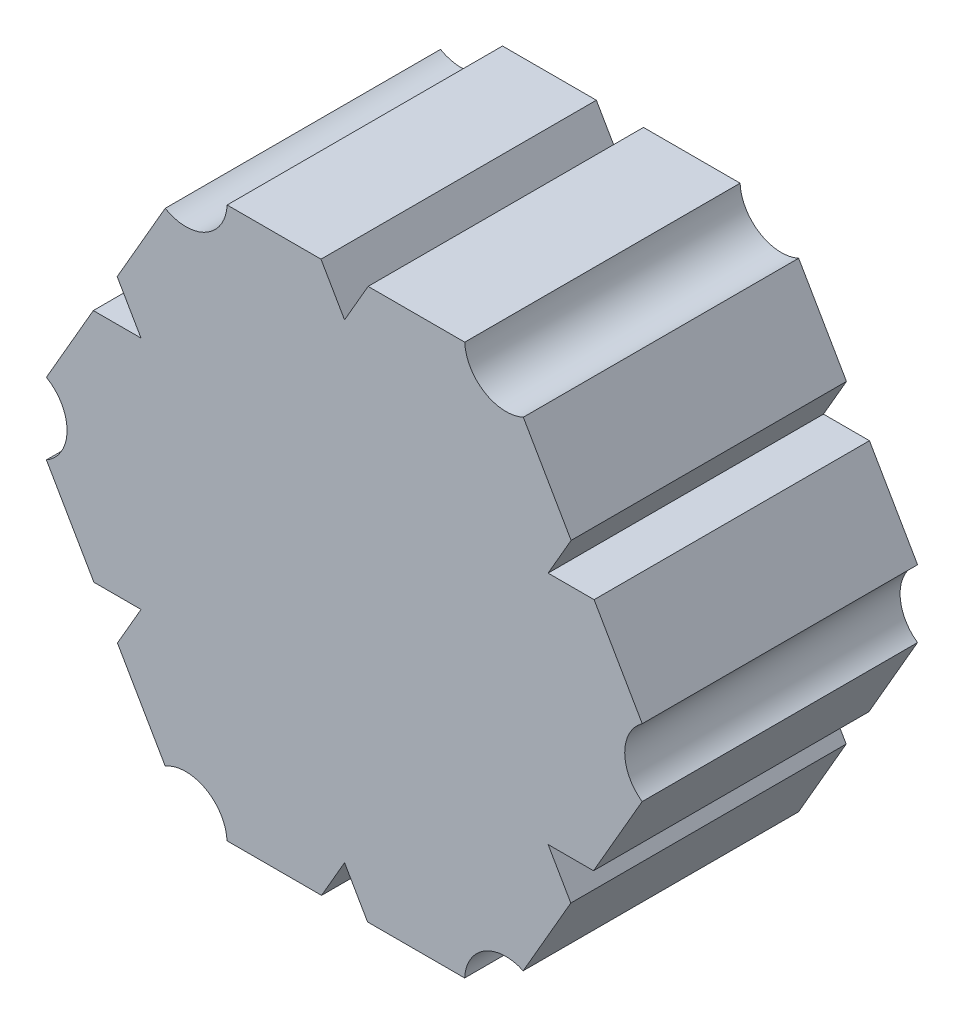
ISO-10303-21;
HEADER;
FILE_DESCRIPTION(('STEP AP214'),'2;1');
FILE_NAME('part.step','',(''),(''),'','','');
FILE_SCHEMA(('AUTOMOTIVE_DESIGN { 1 0 10303 214 1 1 1 1 }'));
ENDSEC;
DATA;
#1=APPLICATION_CONTEXT('core data for automotive mechanical design processes');
#2=APPLICATION_PROTOCOL_DEFINITION('international standard','automotive_design',2000,#1);
#3=PRODUCT_CONTEXT('',#1,'mechanical');
#4=PRODUCT('Part','Part','',(#3));
#5=PRODUCT_RELATED_PRODUCT_CATEGORY('part','',(#4));
#6=PRODUCT_DEFINITION_FORMATION('','',#4);
#7=PRODUCT_DEFINITION_CONTEXT('part definition',#1,'design');
#8=PRODUCT_DEFINITION('design','',#6,#7);
#9=PRODUCT_DEFINITION_SHAPE('','',#8);
#10=(LENGTH_UNIT() NAMED_UNIT(*) SI_UNIT(.MILLI.,.METRE.));
#11=(NAMED_UNIT(*) PLANE_ANGLE_UNIT() SI_UNIT($,.RADIAN.));
#12=(NAMED_UNIT(*) SI_UNIT($,.STERADIAN.) SOLID_ANGLE_UNIT());
#13=UNCERTAINTY_MEASURE_WITH_UNIT(LENGTH_MEASURE(1.E-05),#10,'distance_accuracy_value','');
#14=(GEOMETRIC_REPRESENTATION_CONTEXT(3) GLOBAL_UNCERTAINTY_ASSIGNED_CONTEXT((#13)) GLOBAL_UNIT_ASSIGNED_CONTEXT((#10,
#11,#12)) REPRESENTATION_CONTEXT('',''));
#15=CARTESIAN_POINT('',(0.,0.,0.));
#16=DIRECTION('',(0.,0.,1.));
#17=DIRECTION('',(1.,0.,0.));
#18=AXIS2_PLACEMENT_3D('',#15,#16,#17);
#19=CARTESIAN_POINT('',(11.5470053837925,-20.,10.));
#20=DIRECTION('',(-0.866025403784439,0.5,0.));
#21=DIRECTION('',(-0.5,-0.866025403784439,0.));
#22=AXIS2_PLACEMENT_3D('',#19,#20,#21);
#23=PLANE('',#22);
#24=DIRECTION('',(0.5,0.866025403784439,0.));
#25=VECTOR('',#24,1.);
#26=CARTESIAN_POINT('',(11.5470053837925,-20.,-10.));
#27=LINE('',#26,#25);
#28=CARTESIAN_POINT('',(18.145242431363,-8.5715181932246,-10.));
#29=VERTEX_POINT('',#28);
#30=CARTESIAN_POINT('',(21.6755144377949,-2.45690771354651,-10.));
#31=VERTEX_POINT('',#30);
#32=EDGE_CURVE('E314',#29,#31,#27,.T.);
#33=ORIENTED_EDGE('',*,*,#32,.T.);
#34=DIRECTION('',(0.,0.,1.));
#35=VECTOR('',#34,1.);
#36=CARTESIAN_POINT('',(21.6755144377949,-2.45690771354651,-10.));
#37=LINE('',#36,#35);
#38=CARTESIAN_POINT('',(21.6755144377949,-2.45690771354651,10.));
#39=VERTEX_POINT('',#38);
#40=EDGE_CURVE('E474',#31,#39,#37,.T.);
#41=ORIENTED_EDGE('',*,*,#40,.T.);
#42=DIRECTION('',(0.5,0.866025403784439,0.));
#43=VECTOR('',#42,1.);
#44=CARTESIAN_POINT('',(11.5470053837925,-20.,10.));
#45=LINE('',#44,#43);
#46=CARTESIAN_POINT('',(18.145242431363,-8.5715181932246,10.));
#47=VERTEX_POINT('',#46);
#48=EDGE_CURVE('E260',#47,#39,#45,.T.);
#49=ORIENTED_EDGE('',*,*,#48,.F.);
#50=DIRECTION('',(0.,0.,-1.));
#51=VECTOR('',#50,1.);
#52=CARTESIAN_POINT('',(18.145242431363,-8.5715181932246,10.));
#53=LINE('',#52,#51);
#54=EDGE_CURVE('E420',#47,#29,#53,.T.);
#55=ORIENTED_EDGE('',*,*,#54,.T.);
#56=EDGE_LOOP('',(#33,#41,#49,#55));
#57=FACE_BOUND('',#56,.T.);
#58=ADVANCED_FACE('F39',(#57),#23,.F.);
#59=CARTESIAN_POINT('',(23.094010767585,0.,10.));
#60=DIRECTION('',(-0.866025403784439,-0.5,0.));
#61=DIRECTION('',(0.5,-0.866025403784439,0.));
#62=AXIS2_PLACEMENT_3D('',#59,#60,#61);
#63=PLANE('',#62);
#64=DIRECTION('',(-0.5,0.866025403784438,0.));
#65=VECTOR('',#64,1.);
#66=CARTESIAN_POINT('',(23.094010767585,0.,-10.));
#67=LINE('',#66,#65);
#68=CARTESIAN_POINT('',(16.5164192440695,11.3927227101633,-10.));
#69=VERTEX_POINT('',#68);
#70=CARTESIAN_POINT('',(13.0447315470883,17.4058621893464,-10.));
#71=VERTEX_POINT('',#70);
#72=EDGE_CURVE('E297',#69,#71,#67,.T.);
#73=ORIENTED_EDGE('',*,*,#72,.T.);
#74=DIRECTION('',(0.,0.,1.));
#75=VECTOR('',#74,1.);
#76=CARTESIAN_POINT('',(13.0447315470883,17.4058621893464,-10.));
#77=LINE('',#76,#75);
#78=CARTESIAN_POINT('',(13.0447315470883,17.4058621893464,10.));
#79=VERTEX_POINT('',#78);
#80=EDGE_CURVE('E307',#71,#79,#77,.T.);
#81=ORIENTED_EDGE('',*,*,#80,.T.);
#82=DIRECTION('',(-0.5,0.866025403784438,0.));
#83=VECTOR('',#82,1.);
#84=CARTESIAN_POINT('',(23.094010767585,0.,10.));
#85=LINE('',#84,#83);
#86=CARTESIAN_POINT('',(16.5164192440695,11.3927227101633,10.));
#87=VERTEX_POINT('',#86);
#88=EDGE_CURVE('E446',#87,#79,#85,.T.);
#89=ORIENTED_EDGE('',*,*,#88,.F.);
#90=DIRECTION('',(0.,0.,-1.));
#91=VECTOR('',#90,1.);
#92=CARTESIAN_POINT('',(16.5164192440695,11.3927227101633,10.));
#93=LINE('',#92,#91);
#94=EDGE_CURVE('E309',#87,#69,#93,.T.);
#95=ORIENTED_EDGE('',*,*,#94,.T.);
#96=EDGE_LOOP('',(#73,#81,#89,#95));
#97=FACE_BOUND('',#96,.T.);
#98=ADVANCED_FACE('F305',(#97),#63,.F.);
#99=CARTESIAN_POINT('',(11.5470053837925,20.,10.));
#100=DIRECTION('',(0.,-1.,0.));
#101=DIRECTION('',(0.,0.,-1.));
#102=AXIS2_PLACEMENT_3D('',#99,#100,#101);
#103=PLANE('',#102);
#104=DIRECTION('',(-1.,0.,0.));
#105=VECTOR('',#104,1.);
#106=CARTESIAN_POINT('',(11.5470053837925,20.,-10.));
#107=LINE('',#106,#105);
#108=CARTESIAN_POINT('',(-1.64946871134878,20.,-10.));
#109=VERTEX_POINT('',#108);
#110=CARTESIAN_POINT('',(-8.46702443896172,20.,-10.));
#111=VERTEX_POINT('',#110);
#112=EDGE_CURVE('E313',#109,#111,#107,.T.);
#113=ORIENTED_EDGE('',*,*,#112,.T.);
#114=DIRECTION('',(0.,0.,1.));
#115=VECTOR('',#114,1.);
#116=CARTESIAN_POINT('',(-8.46702443896172,20.,-10.));
#117=LINE('',#116,#115);
#118=CARTESIAN_POINT('',(-8.46702443896172,20.,10.));
#119=VERTEX_POINT('',#118);
#120=EDGE_CURVE('E353',#111,#119,#117,.T.);
#121=ORIENTED_EDGE('',*,*,#120,.T.);
#122=DIRECTION('',(-1.,0.,0.));
#123=VECTOR('',#122,1.);
#124=CARTESIAN_POINT('',(11.5470053837925,20.,10.));
#125=LINE('',#124,#123);
#126=CARTESIAN_POINT('',(-1.64946871134878,20.,10.));
#127=VERTEX_POINT('',#126);
#128=EDGE_CURVE('E449',#127,#119,#125,.T.);
#129=ORIENTED_EDGE('',*,*,#128,.F.);
#130=DIRECTION('',(0.,0.,-1.));
#131=VECTOR('',#130,1.);
#132=CARTESIAN_POINT('',(-1.64946871134878,20.,10.));
#133=LINE('',#132,#131);
#134=EDGE_CURVE('E410',#127,#109,#133,.T.);
#135=ORIENTED_EDGE('',*,*,#134,.T.);
#136=EDGE_LOOP('',(#113,#121,#129,#135));
#137=FACE_BOUND('',#136,.T.);
#138=ADVANCED_FACE('F491',(#137),#103,.F.);
#139=CARTESIAN_POINT('',(-23.094010767585,0.,10.));
#140=DIRECTION('',(0.866025403784439,0.5,0.));
#141=DIRECTION('',(-0.5,0.866025403784439,0.));
#142=AXIS2_PLACEMENT_3D('',#139,#140,#141);
#143=PLANE('',#142);
#144=DIRECTION('',(0.5,-0.866025403784438,0.));
#145=VECTOR('',#144,1.);
#146=CARTESIAN_POINT('',(-23.094010767585,0.,-10.));
#147=LINE('',#146,#145);
#148=CARTESIAN_POINT('',(-16.4338371478492,-11.5357590966123,-10.));
#149=VERTEX_POINT('',#148);
#150=CARTESIAN_POINT('',(-12.9679862666577,-17.5387889142934,-10.));
#151=VERTEX_POINT('',#150);
#152=EDGE_CURVE('E320',#149,#151,#147,.T.);
#153=ORIENTED_EDGE('',*,*,#152,.T.);
#154=DIRECTION('',(0.,0.,1.));
#155=VECTOR('',#154,1.);
#156=CARTESIAN_POINT('',(-12.9679862666577,-17.5387889142934,-10.));
#157=LINE('',#156,#155);
#158=CARTESIAN_POINT('',(-12.9679862666577,-17.5387889142934,10.));
#159=VERTEX_POINT('',#158);
#160=EDGE_CURVE('E54',#151,#159,#157,.T.);
#161=ORIENTED_EDGE('',*,*,#160,.T.);
#162=DIRECTION('',(0.5,-0.866025403784438,0.));
#163=VECTOR('',#162,1.);
#164=CARTESIAN_POINT('',(-23.094010767585,0.,10.));
#165=LINE('',#164,#163);
#166=CARTESIAN_POINT('',(-16.4338371478492,-11.5357590966123,10.));
#167=VERTEX_POINT('',#166);
#168=EDGE_CURVE('E455',#167,#159,#165,.T.);
#169=ORIENTED_EDGE('',*,*,#168,.F.);
#170=DIRECTION('',(0.,0.,-1.));
#171=VECTOR('',#170,1.);
#172=CARTESIAN_POINT('',(-16.4338371478492,-11.5357590966123,10.));
#173=LINE('',#172,#171);
#174=EDGE_CURVE('E430',#167,#149,#173,.T.);
#175=ORIENTED_EDGE('',*,*,#174,.T.);
#176=EDGE_LOOP('',(#153,#161,#169,#175));
#177=FACE_BOUND('',#176,.T.);
#178=ADVANCED_FACE('F523',(#177),#143,.F.);
#179=CARTESIAN_POINT('',(-11.5470053837925,-20.,10.));
#180=DIRECTION('',(0.,1.,0.));
#181=DIRECTION('',(0.,0.,1.));
#182=AXIS2_PLACEMENT_3D('',#179,#180,#181);
#183=PLANE('',#182);
#184=DIRECTION('',(1.,0.,0.));
#185=VECTOR('',#184,1.);
#186=CARTESIAN_POINT('',(-11.5470053837925,-20.,-10.));
#187=LINE('',#186,#185);
#188=CARTESIAN_POINT('',(1.73205080756897,-20.,-10.));
#189=VERTEX_POINT('',#188);
#190=CARTESIAN_POINT('',(8.78352099786609,-20.,-10.));
#191=VERTEX_POINT('',#190);
#192=EDGE_CURVE('E261',#189,#191,#187,.T.);
#193=ORIENTED_EDGE('',*,*,#192,.T.);
#194=DIRECTION('',(0.,0.,1.));
#195=VECTOR('',#194,1.);
#196=CARTESIAN_POINT('',(8.78352099786609,-20.,-10.));
#197=LINE('',#196,#195);
#198=CARTESIAN_POINT('',(8.78352099786609,-20.,10.));
#199=VERTEX_POINT('',#198);
#200=EDGE_CURVE('E62',#191,#199,#197,.T.);
#201=ORIENTED_EDGE('',*,*,#200,.T.);
#202=DIRECTION('',(1.,0.,0.));
#203=VECTOR('',#202,1.);
#204=CARTESIAN_POINT('',(-11.5470053837925,-20.,10.));
#205=LINE('',#204,#203);
#206=CARTESIAN_POINT('',(1.73205080756897,-20.,10.));
#207=VERTEX_POINT('',#206);
#208=EDGE_CURVE('E456',#207,#199,#205,.T.);
#209=ORIENTED_EDGE('',*,*,#208,.F.);
#210=DIRECTION('',(0.,0.,-1.));
#211=VECTOR('',#210,1.);
#212=CARTESIAN_POINT('',(1.73205080756897,-20.,10.));
#213=LINE('',#212,#211);
#214=EDGE_CURVE('E425',#207,#189,#213,.T.);
#215=ORIENTED_EDGE('',*,*,#214,.T.);
#216=EDGE_LOOP('',(#193,#201,#209,#215));
#217=FACE_BOUND('',#216,.T.);
#218=ADVANCED_FACE('F468',(#217),#183,.F.);
#219=CARTESIAN_POINT('',(-11.5470053837925,20.,10.));
#220=DIRECTION('',(0.866025403784439,-0.5,0.));
#221=DIRECTION('',(0.5,0.866025403784439,0.));
#222=AXIS2_PLACEMENT_3D('',#219,#220,#221);
#223=PLANE('',#222);
#224=DIRECTION('',(-0.5,-0.866025403784439,0.));
#225=VECTOR('',#224,1.);
#226=CARTESIAN_POINT('',(-11.5470053837925,20.,-10.));
#227=LINE('',#226,#225);
#228=CARTESIAN_POINT('',(-18.1865334794732,8.5,-10.));
#229=VERTEX_POINT('',#228);
#230=CARTESIAN_POINT('',(-21.594010767585,2.59807621135331,-10.));
#231=VERTEX_POINT('',#230);
#232=EDGE_CURVE('E318',#229,#231,#227,.T.);
#233=ORIENTED_EDGE('',*,*,#232,.T.);
#234=DIRECTION('',(0.,0.,1.));
#235=VECTOR('',#234,1.);
#236=CARTESIAN_POINT('',(-21.594010767585,2.59807621135331,-10.));
#237=LINE('',#236,#235);
#238=CARTESIAN_POINT('',(-21.594010767585,2.59807621135331,10.));
#239=VERTEX_POINT('',#238);
#240=EDGE_CURVE('E332',#231,#239,#237,.T.);
#241=ORIENTED_EDGE('',*,*,#240,.T.);
#242=DIRECTION('',(-0.5,-0.866025403784439,0.));
#243=VECTOR('',#242,1.);
#244=CARTESIAN_POINT('',(-11.5470053837925,20.,10.));
#245=LINE('',#244,#243);
#246=CARTESIAN_POINT('',(-18.1865334794732,8.5,10.));
#247=VERTEX_POINT('',#246);
#248=EDGE_CURVE('E452',#247,#239,#245,.T.);
#249=ORIENTED_EDGE('',*,*,#248,.F.);
#250=DIRECTION('',(0.,0.,-1.));
#251=VECTOR('',#250,1.);
#252=CARTESIAN_POINT('',(-18.1865334794732,8.5,10.));
#253=LINE('',#252,#251);
#254=EDGE_CURVE('E334',#247,#229,#253,.T.);
#255=ORIENTED_EDGE('',*,*,#254,.T.);
#256=EDGE_LOOP('',(#233,#241,#249,#255));
#257=FACE_BOUND('',#256,.T.);
#258=ADVANCED_FACE('F330',(#257),#223,.F.);
#259=CARTESIAN_POINT('',(13.0367656375873,-17.4196595493307,10.));
#260=VERTEX_POINT('',#259);
#261=CARTESIAN_POINT('',(16.4957737200145,-11.4284818067754,10.));
#262=VERTEX_POINT('',#261);
#263=EDGE_CURVE('E264',#260,#262,#45,.T.);
#264=ORIENTED_EDGE('',*,*,#263,.F.);
#265=DIRECTION('',(0.,0.,1.));
#266=VECTOR('',#265,1.);
#267=CARTESIAN_POINT('',(13.0367656375873,-17.4196595493307,-10.));
#268=LINE('',#267,#266);
#269=CARTESIAN_POINT('',(13.0367656375873,-17.4196595493307,-10.));
#270=VERTEX_POINT('',#269);
#271=EDGE_CURVE('E471',#260,#270,#268,.F.);
#272=ORIENTED_EDGE('',*,*,#271,.T.);
#273=CARTESIAN_POINT('',(16.4957737200145,-11.4284818067754,-10.));
#274=VERTEX_POINT('',#273);
#275=EDGE_CURVE('E311',#270,#274,#27,.T.);
#276=ORIENTED_EDGE('',*,*,#275,.T.);
#277=DIRECTION('',(0.,0.,1.));
#278=VECTOR('',#277,1.);
#279=CARTESIAN_POINT('',(16.4957737200145,-11.4284818067754,10.));
#280=LINE('',#279,#278);
#281=EDGE_CURVE('E417',#274,#262,#280,.T.);
#282=ORIENTED_EDGE('',*,*,#281,.T.);
#283=EDGE_LOOP('',(#264,#272,#276,#282));
#284=FACE_BOUND('',#283,.T.);
#285=ADVANCED_FACE('F41',(#284),#23,.F.);
#286=CARTESIAN_POINT('',(21.6830589590391,2.44384021943267,10.));
#287=VERTEX_POINT('',#286);
#288=CARTESIAN_POINT('',(18.1865334794731,8.50000000000017,10.));
#289=VERTEX_POINT('',#288);
#290=EDGE_CURVE('E447',#287,#289,#85,.T.);
#291=ORIENTED_EDGE('',*,*,#290,.F.);
#292=DIRECTION('',(0.,0.,1.));
#293=VECTOR('',#292,1.);
#294=CARTESIAN_POINT('',(21.6830589590391,2.44384021943267,-10.));
#295=LINE('',#294,#293);
#296=CARTESIAN_POINT('',(21.6830589590391,2.44384021943267,-10.));
#297=VERTEX_POINT('',#296);
#298=EDGE_CURVE('E470',#287,#297,#295,.F.);
#299=ORIENTED_EDGE('',*,*,#298,.T.);
#300=CARTESIAN_POINT('',(18.1865334794731,8.50000000000016,-10.));
#301=VERTEX_POINT('',#300);
#302=EDGE_CURVE('E310',#297,#301,#67,.T.);
#303=ORIENTED_EDGE('',*,*,#302,.T.);
#304=DIRECTION('',(0.,0.,1.));
#305=VECTOR('',#304,1.);
#306=CARTESIAN_POINT('',(18.1865334794731,8.50000000000017,10.));
#307=LINE('',#306,#305);
#308=EDGE_CURVE('E413',#301,#289,#307,.T.);
#309=ORIENTED_EDGE('',*,*,#308,.T.);
#310=EDGE_LOOP('',(#291,#299,#303,#309));
#311=FACE_BOUND('',#310,.T.);
#312=ADVANCED_FACE('F553',(#311),#63,.F.);
#313=CARTESIAN_POINT('',(8.79085680455955,20.,10.));
#314=VERTEX_POINT('',#313);
#315=CARTESIAN_POINT('',(1.77334185567881,20.,10.));
#316=VERTEX_POINT('',#315);
#317=EDGE_CURVE('E450',#314,#316,#125,.T.);
#318=ORIENTED_EDGE('',*,*,#317,.F.);
#319=DIRECTION('',(0.,0.,1.));
#320=VECTOR('',#319,1.);
#321=CARTESIAN_POINT('',(8.79085680455955,20.,-10.));
#322=LINE('',#321,#320);
#323=CARTESIAN_POINT('',(8.79085680455955,20.,-10.));
#324=VERTEX_POINT('',#323);
#325=EDGE_CURVE('E482',#314,#324,#322,.F.);
#326=ORIENTED_EDGE('',*,*,#325,.T.);
#327=CARTESIAN_POINT('',(1.77334185567882,20.,-10.));
#328=VERTEX_POINT('',#327);
#329=EDGE_CURVE('E299',#324,#328,#107,.T.);
#330=ORIENTED_EDGE('',*,*,#329,.T.);
#331=DIRECTION('',(0.,0.,1.));
#332=VECTOR('',#331,1.);
#333=CARTESIAN_POINT('',(1.77334185567881,20.,10.));
#334=LINE('',#333,#332);
#335=EDGE_CURVE('E368',#328,#316,#334,.T.);
#336=ORIENTED_EDGE('',*,*,#335,.T.);
#337=EDGE_LOOP('',(#318,#326,#330,#336));
#338=FACE_BOUND('',#337,.T.);
#339=ADVANCED_FACE('F579',(#338),#103,.F.);
#340=CARTESIAN_POINT('',(-12.9679862666579,17.5387889142932,10.));
#341=VERTEX_POINT('',#340);
#342=CARTESIAN_POINT('',(-16.4544826719043,11.5,10.));
#343=VERTEX_POINT('',#342);
#344=EDGE_CURVE('E453',#341,#343,#245,.T.);
#345=ORIENTED_EDGE('',*,*,#344,.F.);
#346=DIRECTION('',(0.,0.,1.));
#347=VECTOR('',#346,1.);
#348=CARTESIAN_POINT('',(-12.9679862666579,17.5387889142932,-10.));
#349=LINE('',#348,#347);
#350=CARTESIAN_POINT('',(-12.9679862666579,17.5387889142932,-10.));
#351=VERTEX_POINT('',#350);
#352=EDGE_CURVE('E485',#341,#351,#349,.F.);
#353=ORIENTED_EDGE('',*,*,#352,.T.);
#354=CARTESIAN_POINT('',(-16.4544826719043,11.5,-10.));
#355=VERTEX_POINT('',#354);
#356=EDGE_CURVE('E319',#351,#355,#227,.T.);
#357=ORIENTED_EDGE('',*,*,#356,.T.);
#358=DIRECTION('',(0.,0.,1.));
#359=VECTOR('',#358,1.);
#360=CARTESIAN_POINT('',(-16.4544826719043,11.5,10.));
#361=LINE('',#360,#359);
#362=EDGE_CURVE('E443',#355,#343,#361,.T.);
#363=ORIENTED_EDGE('',*,*,#362,.T.);
#364=EDGE_LOOP('',(#345,#353,#357,#363));
#365=FACE_BOUND('',#364,.T.);
#366=ADVANCED_FACE('F505',(#365),#223,.F.);
#367=CARTESIAN_POINT('',(-21.594010767585,-2.59807621135332,10.));
#368=VERTEX_POINT('',#367);
#369=CARTESIAN_POINT('',(-18.145242431363,-8.57151819322463,10.));
#370=VERTEX_POINT('',#369);
#371=EDGE_CURVE('E348',#368,#370,#165,.T.);
#372=ORIENTED_EDGE('',*,*,#371,.F.);
#373=DIRECTION('',(0.,0.,1.));
#374=VECTOR('',#373,1.);
#375=CARTESIAN_POINT('',(-21.594010767585,-2.59807621135332,-10.));
#376=LINE('',#375,#374);
#377=CARTESIAN_POINT('',(-21.594010767585,-2.59807621135332,-10.));
#378=VERTEX_POINT('',#377);
#379=EDGE_CURVE('E341',#368,#378,#376,.F.);
#380=ORIENTED_EDGE('',*,*,#379,.T.);
#381=CARTESIAN_POINT('',(-18.145242431363,-8.57151819322463,-10.));
#382=VERTEX_POINT('',#381);
#383=EDGE_CURVE('E267',#378,#382,#147,.T.);
#384=ORIENTED_EDGE('',*,*,#383,.T.);
#385=DIRECTION('',(0.,0.,1.));
#386=VECTOR('',#385,1.);
#387=CARTESIAN_POINT('',(-18.145242431363,-8.57151819322463,10.));
#388=LINE('',#387,#386);
#389=EDGE_CURVE('E428',#382,#370,#388,.T.);
#390=ORIENTED_EDGE('',*,*,#389,.T.);
#391=EDGE_LOOP('',(#372,#380,#384,#390));
#392=FACE_BOUND('',#391,.T.);
#393=ADVANCED_FACE('F345',(#392),#143,.F.);
#394=CARTESIAN_POINT('',(-8.47520038223606,-20.,10.));
#395=VERTEX_POINT('',#394);
#396=CARTESIAN_POINT('',(-1.60817766323827,-20.,10.));
#397=VERTEX_POINT('',#396);
#398=EDGE_CURVE('E251',#395,#397,#205,.T.);
#399=ORIENTED_EDGE('',*,*,#398,.F.);
#400=DIRECTION('',(0.,0.,1.));
#401=VECTOR('',#400,1.);
#402=CARTESIAN_POINT('',(-8.47520038223606,-20.,-10.));
#403=LINE('',#402,#401);
#404=CARTESIAN_POINT('',(-8.47520038223606,-20.,-10.));
#405=VERTEX_POINT('',#404);
#406=EDGE_CURVE('E236',#395,#405,#403,.F.);
#407=ORIENTED_EDGE('',*,*,#406,.T.);
#408=CARTESIAN_POINT('',(-1.60817766323827,-20.,-10.));
#409=VERTEX_POINT('',#408);
#410=EDGE_CURVE('E249',#405,#409,#187,.T.);
#411=ORIENTED_EDGE('',*,*,#410,.T.);
#412=DIRECTION('',(0.,0.,1.));
#413=VECTOR('',#412,1.);
#414=CARTESIAN_POINT('',(-1.60817766323827,-20.,10.));
#415=LINE('',#414,#413);
#416=EDGE_CURVE('E423',#409,#397,#415,.T.);
#417=ORIENTED_EDGE('',*,*,#416,.T.);
#418=EDGE_LOOP('',(#399,#407,#411,#417));
#419=FACE_BOUND('',#418,.T.);
#420=ADVANCED_FACE('F247',(#419),#183,.F.);
#421=CARTESIAN_POINT('',(0.,0.,10.));
#422=DIRECTION('',(0.,0.,1.));
#423=DIRECTION('',(1.,0.,0.));
#424=AXIS2_PLACEMENT_3D('',#421,#422,#423);
#425=PLANE('',#424);
#426=CARTESIAN_POINT('',(-11.4640050745672,20.1345625126329,10.));
#427=DIRECTION('',(0.,0.,1.));
#428=DIRECTION('',(0.50000000000001,-0.866025403784433,0.));
#429=AXIS2_PLACEMENT_3D('',#426,#427,#428);
#430=CIRCLE('',#429,3.);
#431=EDGE_CURVE('E495',#341,#119,#430,.T.);
#432=ORIENTED_EDGE('',*,*,#431,.F.);
#433=ORIENTED_EDGE('',*,*,#344,.T.);
#434=DIRECTION('',(-0.5,0.866025403784439,0.));
#435=VECTOR('',#434,1.);
#436=CARTESIAN_POINT('',(-14.7224318643355,8.5,10.));
#437=LINE('',#436,#435);
#438=CARTESIAN_POINT('',(-14.7224318643355,8.5,10.));
#439=VERTEX_POINT('',#438);
#440=EDGE_CURVE('E437',#439,#343,#437,.T.);
#441=ORIENTED_EDGE('',*,*,#440,.F.);
#442=DIRECTION('',(1.,0.,0.));
#443=VECTOR('',#442,1.);
#444=CARTESIAN_POINT('',(-19.9185842870421,8.5,10.));
#445=LINE('',#444,#443);
#446=EDGE_CURVE('E433',#247,#439,#445,.T.);
#447=ORIENTED_EDGE('',*,*,#446,.F.);
#448=ORIENTED_EDGE('',*,*,#248,.T.);
#449=CARTESIAN_POINT('',(-23.094010767585,0.,10.));
#450=DIRECTION('',(0.,0.,1.));
#451=DIRECTION('',(1.,0.,0.));
#452=AXIS2_PLACEMENT_3D('',#449,#450,#451);
#453=CIRCLE('',#452,3.);
#454=EDGE_CURVE('E349',#368,#239,#453,.T.);
#455=ORIENTED_EDGE('',*,*,#454,.F.);
#456=ORIENTED_EDGE('',*,*,#371,.T.);
#457=DIRECTION('',(-1.,0.,0.));
#458=VECTOR('',#457,1.);
#459=CARTESIAN_POINT('',(-14.7224318643354,-8.57151819322462,10.));
#460=LINE('',#459,#458);
#461=CARTESIAN_POINT('',(-14.7224318643354,-8.57151819322462,10.));
#462=VERTEX_POINT('',#461);
#463=EDGE_CURVE('E360',#462,#370,#460,.T.);
#464=ORIENTED_EDGE('',*,*,#463,.F.);
#465=DIRECTION('',(0.499999999999998,0.86602540378444,0.));
#466=VECTOR('',#465,1.);
#467=CARTESIAN_POINT('',(-17.3205080756887,-13.0715181932246,10.));
#468=LINE('',#467,#466);
#469=EDGE_CURVE('E361',#167,#462,#468,.T.);
#470=ORIENTED_EDGE('',*,*,#469,.F.);
#471=ORIENTED_EDGE('',*,*,#168,.T.);
#472=CARTESIAN_POINT('',(-11.471970984068,-20.1391616326279,10.));
#473=DIRECTION('',(0.,0.,1.));
#474=DIRECTION('',(0.499999999999998,0.86602540378444,0.));
#475=AXIS2_PLACEMENT_3D('',#472,#473,#474);
#476=CIRCLE('',#475,3.);
#477=EDGE_CURVE('E252',#395,#159,#476,.T.);
#478=ORIENTED_EDGE('',*,*,#477,.F.);
#479=ORIENTED_EDGE('',*,*,#398,.T.);
#480=DIRECTION('',(-0.499999999999996,-0.866025403784441,0.));
#481=VECTOR('',#480,1.);
#482=CARTESIAN_POINT('',(0.0619365721653325,-17.1072772898369,10.));
#483=LINE('',#482,#481);
#484=CARTESIAN_POINT('',(0.0619365721653325,-17.1072772898369,10.));
#485=VERTEX_POINT('',#484);
#486=EDGE_CURVE('E370',#485,#397,#483,.T.);
#487=ORIENTED_EDGE('',*,*,#486,.F.);
#488=DIRECTION('',(-0.500000000000004,0.866025403784436,0.));
#489=VECTOR('',#488,1.);
#490=CARTESIAN_POINT('',(2.66001278351867,-21.6072772898369,10.));
#491=LINE('',#490,#489);
#492=EDGE_CURVE('E371',#207,#485,#491,.T.);
#493=ORIENTED_EDGE('',*,*,#492,.F.);
#494=ORIENTED_EDGE('',*,*,#208,.T.);
#495=CARTESIAN_POINT('',(11.7800744924671,-20.1437607526226,10.));
#496=DIRECTION('',(0.,0.,1.));
#497=DIRECTION('',(-0.500000000000004,0.866025403784436,0.));
#498=AXIS2_PLACEMENT_3D('',#495,#496,#497);
#499=CIRCLE('',#498,3.);
#500=EDGE_CURVE('E465',#260,#199,#499,.T.);
#501=ORIENTED_EDGE('',*,*,#500,.F.);
#502=ORIENTED_EDGE('',*,*,#263,.T.);
#503=DIRECTION('',(0.5,-0.866025403784439,0.));
#504=VECTOR('',#503,1.);
#505=CARTESIAN_POINT('',(14.846305008666,-8.5715181932246,10.));
#506=LINE('',#505,#504);
#507=CARTESIAN_POINT('',(14.846305008666,-8.5715181932246,10.));
#508=VERTEX_POINT('',#507);
#509=EDGE_CURVE('E381',#508,#262,#506,.T.);
#510=ORIENTED_EDGE('',*,*,#509,.F.);
#511=DIRECTION('',(-1.,0.,0.));
#512=VECTOR('',#511,1.);
#513=CARTESIAN_POINT('',(20.0424574313726,-8.5715181932246,10.));
#514=LINE('',#513,#512);
#515=EDGE_CURVE('E382',#47,#508,#514,.T.);
#516=ORIENTED_EDGE('',*,*,#515,.F.);
#517=ORIENTED_EDGE('',*,*,#48,.T.);
#518=CARTESIAN_POINT('',(23.4100801854851,-0.00919823998967443,10.));
#519=DIRECTION('',(0.,0.,1.));
#520=DIRECTION('',(-1.,0.,0.));
#521=AXIS2_PLACEMENT_3D('',#518,#519,#520);
#522=CIRCLE('',#521,3.);
#523=EDGE_CURVE('E529',#287,#39,#522,.T.);
#524=ORIENTED_EDGE('',*,*,#523,.F.);
#525=ORIENTED_EDGE('',*,*,#290,.T.);
#526=DIRECTION('',(1.,0.,0.));
#527=VECTOR('',#526,1.);
#528=CARTESIAN_POINT('',(14.8463050086659,8.50000000000014,10.));
#529=LINE('',#528,#527);
#530=CARTESIAN_POINT('',(14.8463050086659,8.50000000000014,10.));
#531=VERTEX_POINT('',#530);
#532=EDGE_CURVE('E392',#531,#289,#529,.T.);
#533=ORIENTED_EDGE('',*,*,#532,.F.);
#534=DIRECTION('',(-0.499999999999992,-0.866025403784443,0.));
#535=VECTOR('',#534,1.);
#536=CARTESIAN_POINT('',(17.4443812200192,13.0000000000002,10.));
#537=LINE('',#536,#535);
#538=EDGE_CURVE('E393',#87,#531,#537,.T.);
#539=ORIENTED_EDGE('',*,*,#538,.F.);
#540=ORIENTED_EDGE('',*,*,#88,.T.);
#541=CARTESIAN_POINT('',(11.788040401968,20.1299633926383,10.));
#542=DIRECTION('',(0.,0.,1.));
#543=DIRECTION('',(-0.499999999999992,-0.866025403784443,0.));
#544=AXIS2_PLACEMENT_3D('',#541,#542,#543);
#545=CIRCLE('',#544,3.);
#546=EDGE_CURVE('E527',#314,#79,#545,.T.);
#547=ORIENTED_EDGE('',*,*,#546,.F.);
#548=ORIENTED_EDGE('',*,*,#317,.T.);
#549=DIRECTION('',(0.49999999999999,0.866025403784444,0.));
#550=VECTOR('',#549,1.);
#551=CARTESIAN_POINT('',(0.061936572165062,17.0357590966123,10.));
#552=LINE('',#551,#550);
#553=CARTESIAN_POINT('',(0.061936572165062,17.0357590966123,10.));
#554=VERTEX_POINT('',#553);
#555=EDGE_CURVE('E402',#554,#316,#552,.T.);
#556=ORIENTED_EDGE('',*,*,#555,.F.);
#557=DIRECTION('',(0.50000000000001,-0.866025403784433,0.));
#558=VECTOR('',#557,1.);
#559=CARTESIAN_POINT('',(-2.53613963918831,21.5357590966123,10.));
#560=LINE('',#559,#558);
#561=EDGE_CURVE('E351',#127,#554,#560,.T.);
#562=ORIENTED_EDGE('',*,*,#561,.F.);
#563=ORIENTED_EDGE('',*,*,#128,.T.);
#564=EDGE_LOOP('',(#432,#433,#441,#447,#448,#455,#456,#464,#470,#471,#478,#479,#487,#493,#494,
#501,#502,#510,#516,#517,#524,#525,#533,#539,#540,#547,#548,#556,#562,#563));
#565=FACE_BOUND('',#564,.T.);
#566=ADVANCED_FACE('F464',(#565),#425,.T.);
#567=CARTESIAN_POINT('',(0.,0.,-10.));
#568=DIRECTION('',(0.,0.,1.));
#569=DIRECTION('',(1.,0.,0.));
#570=AXIS2_PLACEMENT_3D('',#567,#568,#569);
#571=PLANE('',#570);
#572=ORIENTED_EDGE('',*,*,#356,.F.);
#573=CARTESIAN_POINT('',(-11.4640050745672,20.1345625126329,-10.));
#574=DIRECTION('',(0.,0.,1.));
#575=DIRECTION('',(1.,0.,0.));
#576=AXIS2_PLACEMENT_3D('',#573,#574,#575);
#577=CIRCLE('',#576,3.);
#578=EDGE_CURVE('E11',#351,#111,#577,.T.);
#579=ORIENTED_EDGE('',*,*,#578,.T.);
#580=ORIENTED_EDGE('',*,*,#112,.F.);
#581=DIRECTION('',(0.50000000000001,-0.866025403784433,0.));
#582=VECTOR('',#581,1.);
#583=CARTESIAN_POINT('',(7.42315250433294,4.28575909661239,-10.));
#584=LINE('',#583,#582);
#585=CARTESIAN_POINT('',(0.061936572165062,17.0357590966123,-10.));
#586=VERTEX_POINT('',#585);
#587=EDGE_CURVE('E274',#109,#586,#584,.T.);
#588=ORIENTED_EDGE('',*,*,#587,.T.);
#589=DIRECTION('',(0.49999999999999,0.866025403784444,0.));
#590=VECTOR('',#589,1.);
#591=CARTESIAN_POINT('',(0.061936572165062,17.0357590966123,-10.));
#592=LINE('',#591,#590);
#593=EDGE_CURVE('E400',#586,#328,#592,.T.);
#594=ORIENTED_EDGE('',*,*,#593,.T.);
#595=ORIENTED_EDGE('',*,*,#329,.F.);
#596=CARTESIAN_POINT('',(11.788040401968,20.1299633926383,-10.));
#597=DIRECTION('',(0.,0.,1.));
#598=DIRECTION('',(1.,0.,0.));
#599=AXIS2_PLACEMENT_3D('',#596,#597,#598);
#600=CIRCLE('',#599,3.);
#601=EDGE_CURVE('E47',#324,#71,#600,.T.);
#602=ORIENTED_EDGE('',*,*,#601,.T.);
#603=ORIENTED_EDGE('',*,*,#72,.F.);
#604=DIRECTION('',(-0.499999999999992,-0.866025403784443,0.));
#605=VECTOR('',#604,1.);
#606=CARTESIAN_POINT('',(7.45412079041567,-4.30363864491838,-10.));
#607=LINE('',#606,#605);
#608=CARTESIAN_POINT('',(14.8463050086659,8.50000000000014,-10.));
#609=VERTEX_POINT('',#608);
#610=EDGE_CURVE('E277',#69,#609,#607,.T.);
#611=ORIENTED_EDGE('',*,*,#610,.T.);
#612=DIRECTION('',(1.,0.,0.));
#613=VECTOR('',#612,1.);
#614=CARTESIAN_POINT('',(14.8463050086659,8.50000000000014,-10.));
#615=LINE('',#614,#613);
#616=EDGE_CURVE('E389',#609,#301,#615,.T.);
#617=ORIENTED_EDGE('',*,*,#616,.T.);
#618=ORIENTED_EDGE('',*,*,#302,.F.);
#619=CARTESIAN_POINT('',(23.4100801854851,-0.00919823998967443,-10.));
#620=DIRECTION('',(0.,0.,1.));
#621=DIRECTION('',(1.,0.,0.));
#622=AXIS2_PLACEMENT_3D('',#619,#620,#621);
#623=CIRCLE('',#622,3.);
#624=EDGE_CURVE('E291',#297,#31,#623,.T.);
#625=ORIENTED_EDGE('',*,*,#624,.T.);
#626=ORIENTED_EDGE('',*,*,#32,.F.);
#627=DIRECTION('',(-1.,0.,0.));
#628=VECTOR('',#627,1.);
#629=CARTESIAN_POINT('',(0.,-8.5715181932246,-10.));
#630=LINE('',#629,#628);
#631=CARTESIAN_POINT('',(14.846305008666,-8.5715181932246,-10.));
#632=VERTEX_POINT('',#631);
#633=EDGE_CURVE('E280',#29,#632,#630,.T.);
#634=ORIENTED_EDGE('',*,*,#633,.T.);
#635=DIRECTION('',(0.5,-0.866025403784439,0.));
#636=VECTOR('',#635,1.);
#637=CARTESIAN_POINT('',(14.846305008666,-8.5715181932246,-10.));
#638=LINE('',#637,#636);
#639=EDGE_CURVE('E378',#632,#274,#638,.T.);
#640=ORIENTED_EDGE('',*,*,#639,.T.);
#641=ORIENTED_EDGE('',*,*,#275,.F.);
#642=CARTESIAN_POINT('',(11.7800744924671,-20.1437607526226,-10.));
#643=DIRECTION('',(0.,0.,1.));
#644=DIRECTION('',(1.,0.,0.));
#645=AXIS2_PLACEMENT_3D('',#642,#643,#644);
#646=CIRCLE('',#645,3.);
#647=EDGE_CURVE('E242',#270,#191,#646,.T.);
#648=ORIENTED_EDGE('',*,*,#647,.T.);
#649=ORIENTED_EDGE('',*,*,#192,.F.);
#650=DIRECTION('',(-0.500000000000004,0.866025403784436,0.));
#651=VECTOR('',#650,1.);
#652=CARTESIAN_POINT('',(-7.36121593216772,-4.25000000000004,-10.));
#653=LINE('',#652,#651);
#654=CARTESIAN_POINT('',(0.0619365721653325,-17.1072772898369,-10.));
#655=VERTEX_POINT('',#654);
#656=EDGE_CURVE('E283',#189,#655,#653,.T.);
#657=ORIENTED_EDGE('',*,*,#656,.T.);
#658=DIRECTION('',(-0.499999999999996,-0.866025403784441,0.));
#659=VECTOR('',#658,1.);
#660=CARTESIAN_POINT('',(0.0619365721653325,-17.1072772898369,-10.));
#661=LINE('',#660,#659);
#662=EDGE_CURVE('E259',#655,#409,#661,.T.);
#663=ORIENTED_EDGE('',*,*,#662,.T.);
#664=ORIENTED_EDGE('',*,*,#410,.F.);
#665=CARTESIAN_POINT('',(-11.471970984068,-20.1391616326279,-10.));
#666=DIRECTION('',(0.,0.,1.));
#667=DIRECTION('',(1.,0.,0.));
#668=AXIS2_PLACEMENT_3D('',#665,#666,#667);
#669=CIRCLE('',#668,3.);
#670=EDGE_CURVE('E233',#405,#151,#669,.T.);
#671=ORIENTED_EDGE('',*,*,#670,.T.);
#672=ORIENTED_EDGE('',*,*,#152,.F.);
#673=DIRECTION('',(0.499999999999998,0.86602540378444,0.));
#674=VECTOR('',#673,1.);
#675=CARTESIAN_POINT('',(-7.33024764608512,4.23212045169384,-10.));
#676=LINE('',#675,#674);
#677=CARTESIAN_POINT('',(-14.7224318643354,-8.57151819322462,-10.));
#678=VERTEX_POINT('',#677);
#679=EDGE_CURVE('E285',#149,#678,#676,.T.);
#680=ORIENTED_EDGE('',*,*,#679,.T.);
#681=DIRECTION('',(-1.,0.,0.));
#682=VECTOR('',#681,1.);
#683=CARTESIAN_POINT('',(-14.7224318643354,-8.57151819322462,-10.));
#684=LINE('',#683,#682);
#685=EDGE_CURVE('E357',#678,#382,#684,.T.);
#686=ORIENTED_EDGE('',*,*,#685,.T.);
#687=ORIENTED_EDGE('',*,*,#383,.F.);
#688=CARTESIAN_POINT('',(-23.094010767585,0.,-10.));
#689=DIRECTION('',(0.,0.,1.));
#690=DIRECTION('',(1.,0.,0.));
#691=AXIS2_PLACEMENT_3D('',#688,#689,#690);
#692=CIRCLE('',#691,3.);
#693=EDGE_CURVE('E243',#378,#231,#692,.T.);
#694=ORIENTED_EDGE('',*,*,#693,.T.);
#695=ORIENTED_EDGE('',*,*,#232,.F.);
#696=DIRECTION('',(1.,0.,0.));
#697=VECTOR('',#696,1.);
#698=CARTESIAN_POINT('',(0.,8.50000000000001,-10.));
#699=LINE('',#698,#697);
#700=CARTESIAN_POINT('',(-14.7224318643355,8.5,-10.));
#701=VERTEX_POINT('',#700);
#702=EDGE_CURVE('E271',#229,#701,#699,.T.);
#703=ORIENTED_EDGE('',*,*,#702,.T.);
#704=DIRECTION('',(-0.5,0.866025403784439,0.));
#705=VECTOR('',#704,1.);
#706=CARTESIAN_POINT('',(-14.7224318643355,8.5,-10.));
#707=LINE('',#706,#705);
#708=EDGE_CURVE('E434',#701,#355,#707,.T.);
#709=ORIENTED_EDGE('',*,*,#708,.T.);
#710=EDGE_LOOP('',(#572,#579,#580,#588,#594,#595,#602,#603,#611,#617,#618,#625,#626,#634,#640,
#641,#648,#649,#657,#663,#664,#671,#672,#680,#686,#687,#694,#695,#703,#709));
#711=FACE_BOUND('',#710,.T.);
#712=ADVANCED_FACE('F256',(#711),#571,.F.);
#713=CARTESIAN_POINT('',(-19.9185842870421,8.5,-10.));
#714=DIRECTION('',(0.,-1.,0.));
#715=DIRECTION('',(1.,0.,0.));
#716=AXIS2_PLACEMENT_3D('',#713,#714,#715);
#717=PLANE('',#716);
#718=ORIENTED_EDGE('',*,*,#446,.T.);
#719=DIRECTION('',(0.,0.,1.));
#720=VECTOR('',#719,1.);
#721=CARTESIAN_POINT('',(-14.7224318643355,8.5,-10.));
#722=LINE('',#721,#720);
#723=EDGE_CURVE('E436',#701,#439,#722,.T.);
#724=ORIENTED_EDGE('',*,*,#723,.F.);
#725=ORIENTED_EDGE('',*,*,#702,.F.);
#726=ORIENTED_EDGE('',*,*,#254,.F.);
#727=EDGE_LOOP('',(#718,#724,#725,#726));
#728=FACE_BOUND('',#727,.T.);
#729=ADVANCED_FACE('F512',(#728),#717,.F.);
#730=CARTESIAN_POINT('',(-14.7224318643355,8.5,-10.));
#731=DIRECTION('',(0.866025403784439,0.5,0.));
#732=DIRECTION('',(-0.5,0.866025403784439,0.));
#733=AXIS2_PLACEMENT_3D('',#730,#731,#732);
#734=PLANE('',#733);
#735=ORIENTED_EDGE('',*,*,#708,.F.);
#736=ORIENTED_EDGE('',*,*,#723,.T.);
#737=ORIENTED_EDGE('',*,*,#440,.T.);
#738=ORIENTED_EDGE('',*,*,#362,.F.);
#739=EDGE_LOOP('',(#735,#736,#737,#738));
#740=FACE_BOUND('',#739,.T.);
#741=ADVANCED_FACE('F510',(#740),#734,.F.);
#742=CARTESIAN_POINT('',(-2.53613963918831,21.5357590966123,-10.));
#743=DIRECTION('',(-0.866025403784433,-0.50000000000001,0.));
#744=DIRECTION('',(0.50000000000001,-0.866025403784433,0.));
#745=AXIS2_PLACEMENT_3D('',#742,#743,#744);
#746=PLANE('',#745);
#747=ORIENTED_EDGE('',*,*,#561,.T.);
#748=DIRECTION('',(0.,0.,1.));
#749=VECTOR('',#748,1.);
#750=CARTESIAN_POINT('',(0.061936572165062,17.0357590966123,-10.));
#751=LINE('',#750,#749);
#752=EDGE_CURVE('E395',#586,#554,#751,.T.);
#753=ORIENTED_EDGE('',*,*,#752,.F.);
#754=ORIENTED_EDGE('',*,*,#587,.F.);
#755=ORIENTED_EDGE('',*,*,#134,.F.);
#756=EDGE_LOOP('',(#747,#753,#754,#755));
#757=FACE_BOUND('',#756,.T.);
#758=ADVANCED_FACE('F499',(#757),#746,.F.);
#759=CARTESIAN_POINT('',(0.061936572165062,17.0357590966123,-10.));
#760=DIRECTION('',(0.866025403784444,-0.49999999999999,0.));
#761=DIRECTION('',(0.49999999999999,0.866025403784445,0.));
#762=AXIS2_PLACEMENT_3D('',#759,#760,#761);
#763=PLANE('',#762);
#764=ORIENTED_EDGE('',*,*,#593,.F.);
#765=ORIENTED_EDGE('',*,*,#752,.T.);
#766=ORIENTED_EDGE('',*,*,#555,.T.);
#767=ORIENTED_EDGE('',*,*,#335,.F.);
#768=EDGE_LOOP('',(#764,#765,#766,#767));
#769=FACE_BOUND('',#768,.T.);
#770=ADVANCED_FACE('F502',(#769),#763,.F.);
#771=CARTESIAN_POINT('',(17.4443812200192,13.0000000000002,-10.));
#772=DIRECTION('',(-0.866025403784443,0.499999999999992,0.));
#773=DIRECTION('',(-0.499999999999992,-0.866025403784443,0.));
#774=AXIS2_PLACEMENT_3D('',#771,#772,#773);
#775=PLANE('',#774);
#776=ORIENTED_EDGE('',*,*,#538,.T.);
#777=DIRECTION('',(0.,0.,1.));
#778=VECTOR('',#777,1.);
#779=CARTESIAN_POINT('',(14.8463050086659,8.50000000000014,-10.));
#780=LINE('',#779,#778);
#781=EDGE_CURVE('E384',#609,#531,#780,.T.);
#782=ORIENTED_EDGE('',*,*,#781,.F.);
#783=ORIENTED_EDGE('',*,*,#610,.F.);
#784=ORIENTED_EDGE('',*,*,#94,.F.);
#785=EDGE_LOOP('',(#776,#782,#783,#784));
#786=FACE_BOUND('',#785,.T.);
#787=ADVANCED_FACE('F560',(#786),#775,.F.);
#788=CARTESIAN_POINT('',(14.8463050086659,8.50000000000014,-10.));
#789=DIRECTION('',(0.,-1.,0.));
#790=DIRECTION('',(1.,0.,0.));
#791=AXIS2_PLACEMENT_3D('',#788,#789,#790);
#792=PLANE('',#791);
#793=ORIENTED_EDGE('',*,*,#616,.F.);
#794=ORIENTED_EDGE('',*,*,#781,.T.);
#795=ORIENTED_EDGE('',*,*,#532,.T.);
#796=ORIENTED_EDGE('',*,*,#308,.F.);
#797=EDGE_LOOP('',(#793,#794,#795,#796));
#798=FACE_BOUND('',#797,.T.);
#799=ADVANCED_FACE('F555',(#798),#792,.F.);
#800=CARTESIAN_POINT('',(20.0424574313726,-8.5715181932246,-10.));
#801=DIRECTION('',(0.,1.,0.));
#802=DIRECTION('',(-1.,0.,0.));
#803=AXIS2_PLACEMENT_3D('',#800,#801,#802);
#804=PLANE('',#803);
#805=ORIENTED_EDGE('',*,*,#515,.T.);
#806=DIRECTION('',(0.,0.,1.));
#807=VECTOR('',#806,1.);
#808=CARTESIAN_POINT('',(14.846305008666,-8.5715181932246,-10.));
#809=LINE('',#808,#807);
#810=EDGE_CURVE('E373',#632,#508,#809,.T.);
#811=ORIENTED_EDGE('',*,*,#810,.F.);
#812=ORIENTED_EDGE('',*,*,#633,.F.);
#813=ORIENTED_EDGE('',*,*,#54,.F.);
#814=EDGE_LOOP('',(#805,#811,#812,#813));
#815=FACE_BOUND('',#814,.T.);
#816=ADVANCED_FACE('F567',(#815),#804,.F.);
#817=CARTESIAN_POINT('',(14.846305008666,-8.5715181932246,-10.));
#818=DIRECTION('',(-0.866025403784439,-0.5,0.));
#819=DIRECTION('',(0.5,-0.866025403784439,0.));
#820=AXIS2_PLACEMENT_3D('',#817,#818,#819);
#821=PLANE('',#820);
#822=ORIENTED_EDGE('',*,*,#639,.F.);
#823=ORIENTED_EDGE('',*,*,#810,.T.);
#824=ORIENTED_EDGE('',*,*,#509,.T.);
#825=ORIENTED_EDGE('',*,*,#281,.F.);
#826=EDGE_LOOP('',(#822,#823,#824,#825));
#827=FACE_BOUND('',#826,.T.);
#828=ADVANCED_FACE('F538',(#827),#821,.F.);
#829=CARTESIAN_POINT('',(2.66001278351867,-21.6072772898369,-10.));
#830=DIRECTION('',(0.866025403784436,0.500000000000004,0.));
#831=DIRECTION('',(-0.500000000000004,0.866025403784436,0.));
#832=AXIS2_PLACEMENT_3D('',#829,#830,#831);
#833=PLANE('',#832);
#834=ORIENTED_EDGE('',*,*,#492,.T.);
#835=DIRECTION('',(0.,0.,1.));
#836=VECTOR('',#835,1.);
#837=CARTESIAN_POINT('',(0.0619365721653325,-17.1072772898369,-10.));
#838=LINE('',#837,#836);
#839=EDGE_CURVE('E363',#655,#485,#838,.T.);
#840=ORIENTED_EDGE('',*,*,#839,.F.);
#841=ORIENTED_EDGE('',*,*,#656,.F.);
#842=ORIENTED_EDGE('',*,*,#214,.F.);
#843=EDGE_LOOP('',(#834,#840,#841,#842));
#844=FACE_BOUND('',#843,.T.);
#845=ADVANCED_FACE('F652',(#844),#833,.F.);
#846=CARTESIAN_POINT('',(0.0619365721653325,-17.1072772898369,-10.));
#847=DIRECTION('',(-0.866025403784441,0.499999999999996,0.));
#848=DIRECTION('',(-0.499999999999996,-0.866025403784441,0.));
#849=AXIS2_PLACEMENT_3D('',#846,#847,#848);
#850=PLANE('',#849);
#851=ORIENTED_EDGE('',*,*,#662,.F.);
#852=ORIENTED_EDGE('',*,*,#839,.T.);
#853=ORIENTED_EDGE('',*,*,#486,.T.);
#854=ORIENTED_EDGE('',*,*,#416,.F.);
#855=EDGE_LOOP('',(#851,#852,#853,#854));
#856=FACE_BOUND('',#855,.T.);
#857=ADVANCED_FACE('F662',(#856),#850,.F.);
#858=CARTESIAN_POINT('',(-17.3205080756887,-13.0715181932246,-10.));
#859=DIRECTION('',(0.86602540378444,-0.499999999999998,0.));
#860=DIRECTION('',(0.499999999999998,0.86602540378444,0.));
#861=AXIS2_PLACEMENT_3D('',#858,#859,#860);
#862=PLANE('',#861);
#863=ORIENTED_EDGE('',*,*,#469,.T.);
#864=DIRECTION('',(0.,0.,1.));
#865=VECTOR('',#864,1.);
#866=CARTESIAN_POINT('',(-14.7224318643354,-8.57151819322462,-10.));
#867=LINE('',#866,#865);
#868=EDGE_CURVE('E359',#678,#462,#867,.T.);
#869=ORIENTED_EDGE('',*,*,#868,.F.);
#870=ORIENTED_EDGE('',*,*,#679,.F.);
#871=ORIENTED_EDGE('',*,*,#174,.F.);
#872=EDGE_LOOP('',(#863,#869,#870,#871));
#873=FACE_BOUND('',#872,.T.);
#874=ADVANCED_FACE('F519',(#873),#862,.F.);
#875=CARTESIAN_POINT('',(-14.7224318643354,-8.57151819322462,-10.));
#876=DIRECTION('',(0.,1.,0.));
#877=DIRECTION('',(-1.,0.,0.));
#878=AXIS2_PLACEMENT_3D('',#875,#876,#877);
#879=PLANE('',#878);
#880=ORIENTED_EDGE('',*,*,#685,.F.);
#881=ORIENTED_EDGE('',*,*,#868,.T.);
#882=ORIENTED_EDGE('',*,*,#463,.T.);
#883=ORIENTED_EDGE('',*,*,#389,.F.);
#884=EDGE_LOOP('',(#880,#881,#882,#883));
#885=FACE_BOUND('',#884,.T.);
#886=ADVANCED_FACE('F517',(#885),#879,.F.);
#887=CARTESIAN_POINT('',(-23.094010767585,0.,-10.));
#888=DIRECTION('',(0.,0.,1.));
#889=DIRECTION('',(1.,0.,0.));
#890=AXIS2_PLACEMENT_3D('',#887,#888,#889);
#891=CYLINDRICAL_SURFACE('',#890,3.);
#892=ORIENTED_EDGE('',*,*,#693,.F.);
#893=ORIENTED_EDGE('',*,*,#379,.F.);
#894=ORIENTED_EDGE('',*,*,#454,.T.);
#895=ORIENTED_EDGE('',*,*,#240,.F.);
#896=EDGE_LOOP('',(#892,#893,#894,#895));
#897=FACE_BOUND('',#896,.T.);
#898=ADVANCED_FACE('F340',(#897),#891,.F.);
#899=CARTESIAN_POINT('',(-11.471970984068,-20.1391616326279,-10.));
#900=DIRECTION('',(0.,0.,1.));
#901=DIRECTION('',(1.,0.,0.));
#902=AXIS2_PLACEMENT_3D('',#899,#900,#901);
#903=CYLINDRICAL_SURFACE('',#902,3.);
#904=ORIENTED_EDGE('',*,*,#670,.F.);
#905=ORIENTED_EDGE('',*,*,#406,.F.);
#906=ORIENTED_EDGE('',*,*,#477,.T.);
#907=ORIENTED_EDGE('',*,*,#160,.F.);
#908=EDGE_LOOP('',(#904,#905,#906,#907));
#909=FACE_BOUND('',#908,.T.);
#910=ADVANCED_FACE('F235',(#909),#903,.F.);
#911=CARTESIAN_POINT('',(11.7800744924671,-20.1437607526226,-10.));
#912=DIRECTION('',(0.,0.,1.));
#913=DIRECTION('',(1.,0.,0.));
#914=AXIS2_PLACEMENT_3D('',#911,#912,#913);
#915=CYLINDRICAL_SURFACE('',#914,3.);
#916=ORIENTED_EDGE('',*,*,#647,.F.);
#917=ORIENTED_EDGE('',*,*,#271,.F.);
#918=ORIENTED_EDGE('',*,*,#500,.T.);
#919=ORIENTED_EDGE('',*,*,#200,.F.);
#920=EDGE_LOOP('',(#916,#917,#918,#919));
#921=FACE_BOUND('',#920,.T.);
#922=ADVANCED_FACE('F531',(#921),#915,.F.);
#923=CARTESIAN_POINT('',(23.4100801854851,-0.00919823998967443,-10.));
#924=DIRECTION('',(0.,0.,1.));
#925=DIRECTION('',(1.,0.,0.));
#926=AXIS2_PLACEMENT_3D('',#923,#924,#925);
#927=CYLINDRICAL_SURFACE('',#926,3.);
#928=ORIENTED_EDGE('',*,*,#624,.F.);
#929=ORIENTED_EDGE('',*,*,#298,.F.);
#930=ORIENTED_EDGE('',*,*,#523,.T.);
#931=ORIENTED_EDGE('',*,*,#40,.F.);
#932=EDGE_LOOP('',(#928,#929,#930,#931));
#933=FACE_BOUND('',#932,.T.);
#934=ADVANCED_FACE('F547',(#933),#927,.F.);
#935=CARTESIAN_POINT('',(11.788040401968,20.1299633926383,-10.));
#936=DIRECTION('',(0.,0.,1.));
#937=DIRECTION('',(1.,0.,0.));
#938=AXIS2_PLACEMENT_3D('',#935,#936,#937);
#939=CYLINDRICAL_SURFACE('',#938,3.);
#940=ORIENTED_EDGE('',*,*,#601,.F.);
#941=ORIENTED_EDGE('',*,*,#325,.F.);
#942=ORIENTED_EDGE('',*,*,#546,.T.);
#943=ORIENTED_EDGE('',*,*,#80,.F.);
#944=EDGE_LOOP('',(#940,#941,#942,#943));
#945=FACE_BOUND('',#944,.T.);
#946=ADVANCED_FACE('F809',(#945),#939,.F.);
#947=CARTESIAN_POINT('',(-11.4640050745672,20.1345625126329,-10.));
#948=DIRECTION('',(0.,0.,1.));
#949=DIRECTION('',(1.,0.,0.));
#950=AXIS2_PLACEMENT_3D('',#947,#948,#949);
#951=CYLINDRICAL_SURFACE('',#950,3.);
#952=ORIENTED_EDGE('',*,*,#578,.F.);
#953=ORIENTED_EDGE('',*,*,#352,.F.);
#954=ORIENTED_EDGE('',*,*,#431,.T.);
#955=ORIENTED_EDGE('',*,*,#120,.F.);
#956=EDGE_LOOP('',(#952,#953,#954,#955));
#957=FACE_BOUND('',#956,.T.);
#958=ADVANCED_FACE('F504',(#957),#951,.F.);
#959=CLOSED_SHELL('',(#58,#98,#138,#178,#218,#258,#285,#312,#339,#366,#393,#420,#566,#712,#729,
#741,#758,#770,#787,#799,#816,#828,#845,#857,#874,#886,#898,#910,#922,#934,#946,#958));
#960=MANIFOLD_SOLID_BREP('B2',#959);
#961=ADVANCED_BREP_SHAPE_REPRESENTATION('',(#18,#960),#14);
#962=SHAPE_DEFINITION_REPRESENTATION(#9,#961);
ENDSEC;
END-ISO-10303-21;
